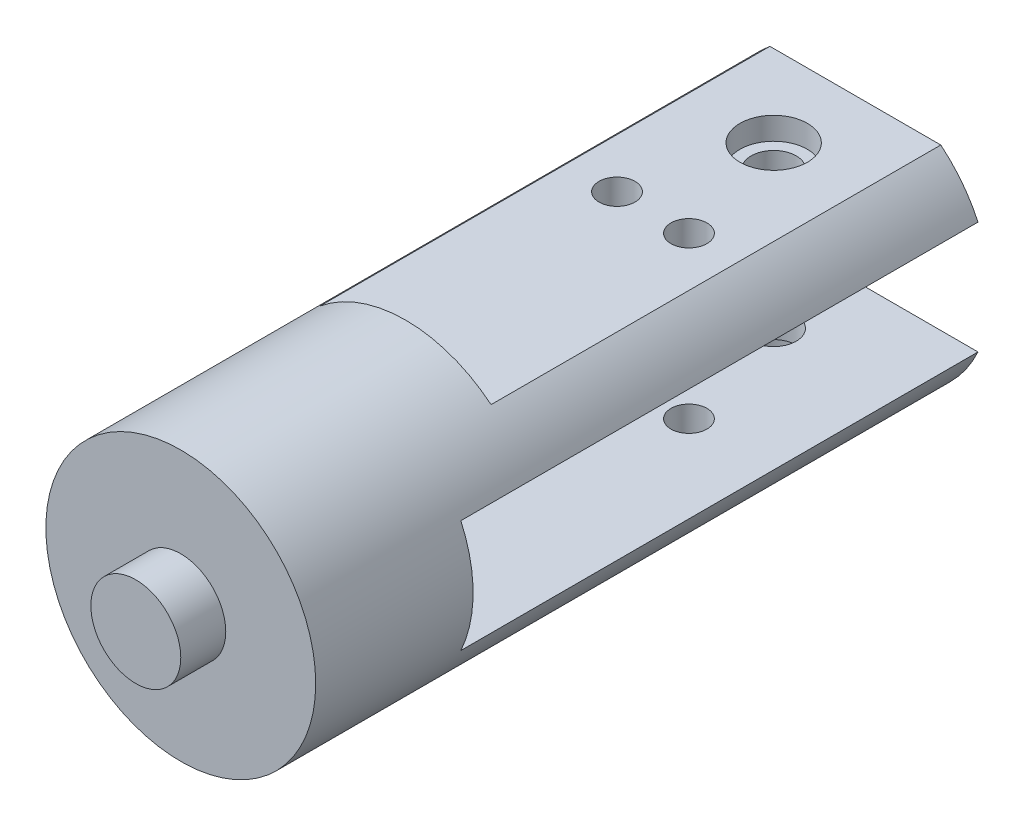
ISO-10303-21;
HEADER;
FILE_DESCRIPTION(('STEP AP214'),'2;1');
FILE_NAME('part.step','',(''),(''),'','','');
FILE_SCHEMA(('AUTOMOTIVE_DESIGN { 1 0 10303 214 1 1 1 1 }'));
ENDSEC;
DATA;
#1=APPLICATION_CONTEXT('core data for automotive mechanical design processes');
#2=APPLICATION_PROTOCOL_DEFINITION('international standard','automotive_design',2000,#1);
#3=PRODUCT_CONTEXT('',#1,'mechanical');
#4=PRODUCT('Part','Part','',(#3));
#5=PRODUCT_RELATED_PRODUCT_CATEGORY('part','',(#4));
#6=PRODUCT_DEFINITION_FORMATION('','',#4);
#7=PRODUCT_DEFINITION_CONTEXT('part definition',#1,'design');
#8=PRODUCT_DEFINITION('design','',#6,#7);
#9=PRODUCT_DEFINITION_SHAPE('','',#8);
#10=(LENGTH_UNIT() NAMED_UNIT(*) SI_UNIT(.MILLI.,.METRE.));
#11=(NAMED_UNIT(*) PLANE_ANGLE_UNIT() SI_UNIT($,.RADIAN.));
#12=(NAMED_UNIT(*) SI_UNIT($,.STERADIAN.) SOLID_ANGLE_UNIT());
#13=UNCERTAINTY_MEASURE_WITH_UNIT(LENGTH_MEASURE(1.E-05),#10,'distance_accuracy_value','');
#14=(GEOMETRIC_REPRESENTATION_CONTEXT(3) GLOBAL_UNCERTAINTY_ASSIGNED_CONTEXT((#13)) GLOBAL_UNIT_ASSIGNED_CONTEXT((#10,
#11,#12)) REPRESENTATION_CONTEXT('',''));
#15=CARTESIAN_POINT('',(0.,0.,0.));
#16=DIRECTION('',(0.,0.,1.));
#17=DIRECTION('',(1.,0.,0.));
#18=AXIS2_PLACEMENT_3D('',#15,#16,#17);
#19=CARTESIAN_POINT('',(0.,0.,-19.4348701517151));
#20=DIRECTION('',(0.,0.,-1.));
#21=DIRECTION('',(-1.,0.,0.));
#22=AXIS2_PLACEMENT_3D('',#19,#20,#21);
#23=CYLINDRICAL_SURFACE('',#22,6.);
#24=CARTESIAN_POINT('',(0.,0.,-19.4348701517151));
#25=DIRECTION('',(0.,0.,1.));
#26=DIRECTION('',(1.,0.,0.));
#27=AXIS2_PLACEMENT_3D('',#24,#25,#26);
#28=CIRCLE('',#27,6.);
#29=CARTESIAN_POINT('',(6.,0.,-19.4348701517151));
#30=VERTEX_POINT('',#29);
#31=EDGE_CURVE('E12',#30,#30,#28,.T.);
#32=ORIENTED_EDGE('',*,*,#31,.F.);
#33=EDGE_LOOP('',(#32));
#34=FACE_BOUND('',#33,.T.);
#35=CARTESIAN_POINT('',(0.,0.,-29.4348701517151));
#36=DIRECTION('',(0.,0.,-1.));
#37=DIRECTION('',(1.,0.,0.));
#38=AXIS2_PLACEMENT_3D('',#35,#36,#37);
#39=CIRCLE('',#38,6.00000000000001);
#40=CARTESIAN_POINT('',(-3.8,4.64327470649756,-29.4348701517151));
#41=VERTEX_POINT('',#40);
#42=CARTESIAN_POINT('',(3.8,4.64327470649756,-29.4348701517151));
#43=VERTEX_POINT('',#42);
#44=EDGE_CURVE('E133',#41,#43,#39,.T.);
#45=ORIENTED_EDGE('',*,*,#44,.F.);
#46=DIRECTION('',(0.,0.,-1.));
#47=VECTOR('',#46,1.);
#48=CARTESIAN_POINT('',(-3.8,4.64327470649756,-29.4348701517151));
#49=LINE('',#48,#47);
#50=CARTESIAN_POINT('',(-3.8,4.64327470649756,-49.4348701517151));
#51=VERTEX_POINT('',#50);
#52=EDGE_CURVE('E142',#41,#51,#49,.T.);
#53=ORIENTED_EDGE('',*,*,#52,.T.);
#54=CARTESIAN_POINT('',(0.,0.,-49.4348701517151));
#55=DIRECTION('',(0.,0.,1.));
#56=DIRECTION('',(1.,0.,0.));
#57=AXIS2_PLACEMENT_3D('',#54,#55,#56);
#58=CIRCLE('',#57,6.);
#59=CARTESIAN_POINT('',(-5.45435605731786,2.5,-49.4348701517151));
#60=VERTEX_POINT('',#59);
#61=EDGE_CURVE('E213',#51,#60,#58,.T.);
#62=ORIENTED_EDGE('',*,*,#61,.T.);
#63=DIRECTION('',(0.,0.,-1.));
#64=VECTOR('',#63,1.);
#65=CARTESIAN_POINT('',(-5.45435605731786,2.5,-26.4348701517151));
#66=LINE('',#65,#64);
#67=CARTESIAN_POINT('',(-5.45435605731786,2.5,-26.4348701517151));
#68=VERTEX_POINT('',#67);
#69=EDGE_CURVE('E190',#68,#60,#66,.T.);
#70=ORIENTED_EDGE('',*,*,#69,.F.);
#71=CARTESIAN_POINT('',(0.,0.,-26.4348701517151));
#72=DIRECTION('',(0.,0.,-1.));
#73=DIRECTION('',(-1.,0.,0.));
#74=AXIS2_PLACEMENT_3D('',#71,#72,#73);
#75=CIRCLE('',#74,6.);
#76=CARTESIAN_POINT('',(-5.45435605731786,-2.5,-26.4348701517151));
#77=VERTEX_POINT('',#76);
#78=EDGE_CURVE('E186',#77,#68,#75,.T.);
#79=ORIENTED_EDGE('',*,*,#78,.F.);
#80=DIRECTION('',(0.,0.,-1.));
#81=VECTOR('',#80,1.);
#82=CARTESIAN_POINT('',(-5.45435605731786,-2.5,-26.4348701517151));
#83=LINE('',#82,#81);
#84=CARTESIAN_POINT('',(-5.45435605731786,-2.5,-49.4348701517151));
#85=VERTEX_POINT('',#84);
#86=EDGE_CURVE('E178',#77,#85,#83,.T.);
#87=ORIENTED_EDGE('',*,*,#86,.T.);
#88=CARTESIAN_POINT('',(-3.8,-4.64327470649756,-49.4348701517151));
#89=VERTEX_POINT('',#88);
#90=EDGE_CURVE('E214',#85,#89,#58,.T.);
#91=ORIENTED_EDGE('',*,*,#90,.T.);
#92=DIRECTION('',(0.,0.,-1.));
#93=VECTOR('',#92,1.);
#94=CARTESIAN_POINT('',(-3.8,-4.64327470649756,-29.4348701517151));
#95=LINE('',#94,#93);
#96=CARTESIAN_POINT('',(-3.8,-4.64327470649756,-29.4348701517151));
#97=VERTEX_POINT('',#96);
#98=EDGE_CURVE('E89',#97,#89,#95,.T.);
#99=ORIENTED_EDGE('',*,*,#98,.F.);
#100=CARTESIAN_POINT('',(0.,0.,-29.4348701517151));
#101=DIRECTION('',(0.,0.,-1.));
#102=DIRECTION('',(-1.,0.,0.));
#103=AXIS2_PLACEMENT_3D('',#100,#101,#102);
#104=CIRCLE('',#103,5.99999999999998);
#105=CARTESIAN_POINT('',(3.8,-4.64327470649756,-29.4348701517151));
#106=VERTEX_POINT('',#105);
#107=EDGE_CURVE('E167',#106,#97,#104,.T.);
#108=ORIENTED_EDGE('',*,*,#107,.F.);
#109=DIRECTION('',(0.,0.,-1.));
#110=VECTOR('',#109,1.);
#111=CARTESIAN_POINT('',(3.8,-4.64327470649756,-29.4348701517151));
#112=LINE('',#111,#110);
#113=CARTESIAN_POINT('',(3.8,-4.64327470649756,-49.4348701517151));
#114=VERTEX_POINT('',#113);
#115=EDGE_CURVE('E159',#106,#114,#112,.T.);
#116=ORIENTED_EDGE('',*,*,#115,.T.);
#117=CARTESIAN_POINT('',(5.45435605731786,-2.5,-49.4348701517151));
#118=VERTEX_POINT('',#117);
#119=EDGE_CURVE('E183',#114,#118,#58,.T.);
#120=ORIENTED_EDGE('',*,*,#119,.T.);
#121=DIRECTION('',(0.,0.,-1.));
#122=VECTOR('',#121,1.);
#123=CARTESIAN_POINT('',(5.45435605731786,-2.5,-26.4348701517151));
#124=LINE('',#123,#122);
#125=CARTESIAN_POINT('',(5.45435605731786,-2.5,-26.4348701517151));
#126=VERTEX_POINT('',#125);
#127=EDGE_CURVE('E179',#126,#118,#124,.T.);
#128=ORIENTED_EDGE('',*,*,#127,.F.);
#129=CARTESIAN_POINT('',(0.,0.,-26.4348701517151));
#130=DIRECTION('',(0.,0.,-1.));
#131=DIRECTION('',(-1.,0.,0.));
#132=AXIS2_PLACEMENT_3D('',#129,#130,#131);
#133=CIRCLE('',#132,6.);
#134=CARTESIAN_POINT('',(5.45435605731786,2.5,-26.4348701517151));
#135=VERTEX_POINT('',#134);
#136=EDGE_CURVE('E173',#135,#126,#133,.T.);
#137=ORIENTED_EDGE('',*,*,#136,.F.);
#138=DIRECTION('',(0.,0.,-1.));
#139=VECTOR('',#138,1.);
#140=CARTESIAN_POINT('',(5.45435605731786,2.5,-26.4348701517151));
#141=LINE('',#140,#139);
#142=CARTESIAN_POINT('',(5.45435605731786,2.5,-49.4348701517151));
#143=VERTEX_POINT('',#142);
#144=EDGE_CURVE('E177',#135,#143,#141,.T.);
#145=ORIENTED_EDGE('',*,*,#144,.T.);
#146=CARTESIAN_POINT('',(3.8,4.64327470649756,-49.4348701517151));
#147=VERTEX_POINT('',#146);
#148=EDGE_CURVE('E148',#143,#147,#58,.T.);
#149=ORIENTED_EDGE('',*,*,#148,.T.);
#150=DIRECTION('',(0.,0.,-1.));
#151=VECTOR('',#150,1.);
#152=CARTESIAN_POINT('',(3.8,4.64327470649756,-29.4348701517151));
#153=LINE('',#152,#151);
#154=EDGE_CURVE('E81',#43,#147,#153,.T.);
#155=ORIENTED_EDGE('',*,*,#154,.F.);
#156=EDGE_LOOP('',(#45,#53,#62,#70,#79,#87,#91,#99,#108,#116,#120,#128,#137,#145,#149,#155));
#157=FACE_BOUND('',#156,.T.);
#158=ADVANCED_FACE('F64',(#34,#157),#23,.T.);
#159=CARTESIAN_POINT('',(0.,0.,-49.4348701517151));
#160=DIRECTION('',(0.,0.,1.));
#161=DIRECTION('',(1.,0.,0.));
#162=AXIS2_PLACEMENT_3D('',#159,#160,#161);
#163=PLANE('',#162);
#164=ORIENTED_EDGE('',*,*,#61,.F.);
#165=DIRECTION('',(-1.,0.,0.));
#166=VECTOR('',#165,1.);
#167=CARTESIAN_POINT('',(3.8,4.64327470649756,-49.4348701517151));
#168=LINE('',#167,#166);
#169=EDGE_CURVE('E139',#147,#51,#168,.T.);
#170=ORIENTED_EDGE('',*,*,#169,.F.);
#171=ORIENTED_EDGE('',*,*,#148,.F.);
#172=DIRECTION('',(-1.,0.,0.));
#173=VECTOR('',#172,1.);
#174=CARTESIAN_POINT('',(5.45435605731786,2.5,-49.4348701517151));
#175=LINE('',#174,#173);
#176=EDGE_CURVE('E202',#143,#60,#175,.T.);
#177=ORIENTED_EDGE('',*,*,#176,.T.);
#178=EDGE_LOOP('',(#164,#170,#171,#177));
#179=FACE_BOUND('',#178,.T.);
#180=ADVANCED_FACE('F280',(#179),#163,.F.);
#181=CARTESIAN_POINT('',(0.,0.,-19.4348701517151));
#182=DIRECTION('',(0.,0.,1.));
#183=DIRECTION('',(1.,0.,0.));
#184=AXIS2_PLACEMENT_3D('',#181,#182,#183);
#185=PLANE('',#184);
#186=CARTESIAN_POINT('',(0.,0.,-19.4348701517151));
#187=DIRECTION('',(0.,0.,1.));
#188=DIRECTION('',(1.,0.,0.));
#189=AXIS2_PLACEMENT_3D('',#186,#187,#188);
#190=CIRCLE('',#189,2.);
#191=CARTESIAN_POINT('',(2.,0.,-19.4348701517151));
#192=VERTEX_POINT('',#191);
#193=EDGE_CURVE('E73',#192,#192,#190,.F.);
#194=ORIENTED_EDGE('',*,*,#193,.T.);
#195=EDGE_LOOP('',(#194));
#196=FACE_BOUND('',#195,.T.);
#197=ORIENTED_EDGE('',*,*,#31,.T.);
#198=EDGE_LOOP('',(#197));
#199=FACE_BOUND('',#198,.T.);
#200=ADVANCED_FACE('F317',(#196,#199),#185,.T.);
#201=CARTESIAN_POINT('',(0.,0.,-17.4348701517151));
#202=DIRECTION('',(0.,0.,-1.));
#203=DIRECTION('',(-1.,0.,0.));
#204=AXIS2_PLACEMENT_3D('',#201,#202,#203);
#205=CYLINDRICAL_SURFACE('',#204,2.);
#206=ORIENTED_EDGE('',*,*,#193,.F.);
#207=EDGE_LOOP('',(#206));
#208=FACE_BOUND('',#207,.T.);
#209=CARTESIAN_POINT('',(0.,0.,-17.4348701517151));
#210=DIRECTION('',(0.,0.,1.));
#211=DIRECTION('',(1.,0.,0.));
#212=AXIS2_PLACEMENT_3D('',#209,#210,#211);
#213=CIRCLE('',#212,2.);
#214=CARTESIAN_POINT('',(2.,0.,-17.4348701517151));
#215=VERTEX_POINT('',#214);
#216=EDGE_CURVE('E212',#215,#215,#213,.T.);
#217=ORIENTED_EDGE('',*,*,#216,.F.);
#218=EDGE_LOOP('',(#217));
#219=FACE_BOUND('',#218,.T.);
#220=ADVANCED_FACE('F322',(#208,#219),#205,.T.);
#221=CARTESIAN_POINT('',(0.,0.,-17.4348701517151));
#222=DIRECTION('',(0.,0.,1.));
#223=DIRECTION('',(1.,0.,0.));
#224=AXIS2_PLACEMENT_3D('',#221,#222,#223);
#225=PLANE('',#224);
#226=ORIENTED_EDGE('',*,*,#216,.T.);
#227=EDGE_LOOP('',(#226));
#228=FACE_BOUND('',#227,.T.);
#229=ADVANCED_FACE('F327',(#228),#225,.T.);
#230=ORIENTED_EDGE('',*,*,#119,.F.);
#231=DIRECTION('',(1.,0.,0.));
#232=VECTOR('',#231,1.);
#233=CARTESIAN_POINT('',(3.8,-4.64327470649756,-49.4348701517151));
#234=LINE('',#233,#232);
#235=EDGE_CURVE('E164',#89,#114,#234,.T.);
#236=ORIENTED_EDGE('',*,*,#235,.F.);
#237=ORIENTED_EDGE('',*,*,#90,.F.);
#238=DIRECTION('',(-1.,0.,0.));
#239=VECTOR('',#238,1.);
#240=CARTESIAN_POINT('',(5.45435605731786,-2.5,-49.4348701517151));
#241=LINE('',#240,#239);
#242=EDGE_CURVE('E152',#118,#85,#241,.T.);
#243=ORIENTED_EDGE('',*,*,#242,.F.);
#244=EDGE_LOOP('',(#230,#236,#237,#243));
#245=FACE_BOUND('',#244,.T.);
#246=ADVANCED_FACE('F294',(#245),#163,.F.);
#247=CARTESIAN_POINT('',(0.,0.,-26.4348701517151));
#248=DIRECTION('',(0.,0.,-1.));
#249=DIRECTION('',(-1.,0.,0.));
#250=AXIS2_PLACEMENT_3D('',#247,#248,#249);
#251=PLANE('',#250);
#252=ORIENTED_EDGE('',*,*,#136,.T.);
#253=DIRECTION('',(-1.,0.,0.));
#254=VECTOR('',#253,1.);
#255=CARTESIAN_POINT('',(5.45435605731786,-2.5,-26.4348701517151));
#256=LINE('',#255,#254);
#257=EDGE_CURVE('E198',#126,#77,#256,.T.);
#258=ORIENTED_EDGE('',*,*,#257,.T.);
#259=ORIENTED_EDGE('',*,*,#78,.T.);
#260=DIRECTION('',(-1.,0.,0.));
#261=VECTOR('',#260,1.);
#262=CARTESIAN_POINT('',(5.45435605731786,2.5,-26.4348701517151));
#263=LINE('',#262,#261);
#264=EDGE_CURVE('E191',#135,#68,#263,.T.);
#265=ORIENTED_EDGE('',*,*,#264,.F.);
#266=EDGE_LOOP('',(#252,#258,#259,#265));
#267=FACE_BOUND('',#266,.T.);
#268=ADVANCED_FACE('F297',(#267),#251,.T.);
#269=CARTESIAN_POINT('',(5.45435605731786,2.5,-26.4348701517151));
#270=DIRECTION('',(0.,-1.,0.));
#271=DIRECTION('',(0.,0.,-1.));
#272=AXIS2_PLACEMENT_3D('',#269,#270,#271);
#273=PLANE('',#272);
#274=CARTESIAN_POINT('',(0.,2.5,-45.8034744182912));
#275=DIRECTION('',(0.,-1.,0.));
#276=DIRECTION('',(0.,0.,-1.));
#277=AXIS2_PLACEMENT_3D('',#274,#275,#276);
#278=CIRCLE('',#277,1.);
#279=CARTESIAN_POINT('',(0.,2.5,-46.8034744182912));
#280=VERTEX_POINT('',#279);
#281=EDGE_CURVE('E224',#280,#280,#278,.F.);
#282=ORIENTED_EDGE('',*,*,#281,.T.);
#283=EDGE_LOOP('',(#282));
#284=FACE_BOUND('',#283,.T.);
#285=CARTESIAN_POINT('',(-1.6,2.5,-40.4348701517151));
#286=DIRECTION('',(0.,-1.,0.));
#287=DIRECTION('',(0.,0.,-1.));
#288=AXIS2_PLACEMENT_3D('',#285,#286,#287);
#289=CIRCLE('',#288,0.800000000000002);
#290=CARTESIAN_POINT('',(-1.6,2.5,-41.2348701517151));
#291=VERTEX_POINT('',#290);
#292=EDGE_CURVE('E163',#291,#291,#289,.T.);
#293=ORIENTED_EDGE('',*,*,#292,.F.);
#294=EDGE_LOOP('',(#293));
#295=FACE_BOUND('',#294,.T.);
#296=CARTESIAN_POINT('',(1.6,2.5,-40.4348701517151));
#297=DIRECTION('',(0.,-1.,0.));
#298=DIRECTION('',(0.,0.,-1.));
#299=AXIS2_PLACEMENT_3D('',#296,#297,#298);
#300=CIRCLE('',#299,0.800000000000001);
#301=CARTESIAN_POINT('',(1.6,2.5,-41.2348701517151));
#302=VERTEX_POINT('',#301);
#303=EDGE_CURVE('E262',#302,#302,#300,.T.);
#304=ORIENTED_EDGE('',*,*,#303,.F.);
#305=EDGE_LOOP('',(#304));
#306=FACE_BOUND('',#305,.T.);
#307=ORIENTED_EDGE('',*,*,#176,.F.);
#308=ORIENTED_EDGE('',*,*,#144,.F.);
#309=ORIENTED_EDGE('',*,*,#264,.T.);
#310=ORIENTED_EDGE('',*,*,#69,.T.);
#311=EDGE_LOOP('',(#307,#308,#309,#310));
#312=FACE_BOUND('',#311,.T.);
#313=ADVANCED_FACE('F300',(#284,#295,#306,#312),#273,.T.);
#314=CARTESIAN_POINT('',(5.45435605731786,-2.5,-26.4348701517151));
#315=DIRECTION('',(0.,-1.,0.));
#316=DIRECTION('',(0.,0.,-1.));
#317=AXIS2_PLACEMENT_3D('',#314,#315,#316);
#318=PLANE('',#317);
#319=CARTESIAN_POINT('',(0.,-2.5,-45.8034744182912));
#320=DIRECTION('',(0.,-1.,0.));
#321=DIRECTION('',(0.,0.,-1.));
#322=AXIS2_PLACEMENT_3D('',#319,#320,#321);
#323=CIRCLE('',#322,1.);
#324=CARTESIAN_POINT('',(0.,-2.5,-46.8034744182912));
#325=VERTEX_POINT('',#324);
#326=EDGE_CURVE('E530',#325,#325,#323,.F.);
#327=ORIENTED_EDGE('',*,*,#326,.F.);
#328=EDGE_LOOP('',(#327));
#329=FACE_BOUND('',#328,.T.);
#330=CARTESIAN_POINT('',(-1.6,-2.5,-40.4348701517151));
#331=DIRECTION('',(0.,-1.,0.));
#332=DIRECTION('',(0.,0.,-1.));
#333=AXIS2_PLACEMENT_3D('',#330,#331,#332);
#334=CIRCLE('',#333,0.800000000000002);
#335=CARTESIAN_POINT('',(-1.6,-2.5,-41.2348701517151));
#336=VERTEX_POINT('',#335);
#337=EDGE_CURVE('E270',#336,#336,#334,.T.);
#338=ORIENTED_EDGE('',*,*,#337,.T.);
#339=EDGE_LOOP('',(#338));
#340=FACE_BOUND('',#339,.T.);
#341=CARTESIAN_POINT('',(1.6,-2.5,-40.4348701517151));
#342=DIRECTION('',(0.,-1.,0.));
#343=DIRECTION('',(0.,0.,-1.));
#344=AXIS2_PLACEMENT_3D('',#341,#342,#343);
#345=CIRCLE('',#344,0.800000000000001);
#346=CARTESIAN_POINT('',(1.6,-2.5,-41.2348701517151));
#347=VERTEX_POINT('',#346);
#348=EDGE_CURVE('E258',#347,#347,#345,.T.);
#349=ORIENTED_EDGE('',*,*,#348,.T.);
#350=EDGE_LOOP('',(#349));
#351=FACE_BOUND('',#350,.T.);
#352=ORIENTED_EDGE('',*,*,#242,.T.);
#353=ORIENTED_EDGE('',*,*,#86,.F.);
#354=ORIENTED_EDGE('',*,*,#257,.F.);
#355=ORIENTED_EDGE('',*,*,#127,.T.);
#356=EDGE_LOOP('',(#352,#353,#354,#355));
#357=FACE_BOUND('',#356,.T.);
#358=ADVANCED_FACE('F292',(#329,#340,#351,#357),#318,.F.);
#359=CARTESIAN_POINT('',(3.8,-4.64327470649756,-29.4348701517151));
#360=DIRECTION('',(0.,1.,0.));
#361=DIRECTION('',(0.,0.,1.));
#362=AXIS2_PLACEMENT_3D('',#359,#360,#361);
#363=PLANE('',#362);
#364=CARTESIAN_POINT('',(0.,-4.64327470649756,-45.8034744182912));
#365=DIRECTION('',(0.,1.,0.));
#366=DIRECTION('',(0.,0.,1.));
#367=AXIS2_PLACEMENT_3D('',#364,#365,#366);
#368=CIRCLE('',#367,1.5);
#369=CARTESIAN_POINT('',(0.,-4.64327470649756,-44.3034744182912));
#370=VERTEX_POINT('',#369);
#371=EDGE_CURVE('E239',#370,#370,#368,.T.);
#372=ORIENTED_EDGE('',*,*,#371,.T.);
#373=EDGE_LOOP('',(#372));
#374=FACE_BOUND('',#373,.T.);
#375=CARTESIAN_POINT('',(-1.6,-4.64327470649756,-40.4348701517151));
#376=DIRECTION('',(0.,1.,0.));
#377=DIRECTION('',(0.,0.,1.));
#378=AXIS2_PLACEMENT_3D('',#375,#376,#377);
#379=CIRCLE('',#378,0.800000000000002);
#380=CARTESIAN_POINT('',(-1.6,-4.64327470649756,-39.6348701517151));
#381=VERTEX_POINT('',#380);
#382=EDGE_CURVE('E266',#381,#381,#379,.T.);
#383=ORIENTED_EDGE('',*,*,#382,.T.);
#384=EDGE_LOOP('',(#383));
#385=FACE_BOUND('',#384,.T.);
#386=CARTESIAN_POINT('',(1.6,-4.64327470649756,-40.4348701517151));
#387=DIRECTION('',(0.,1.,0.));
#388=DIRECTION('',(0.,0.,1.));
#389=AXIS2_PLACEMENT_3D('',#386,#387,#388);
#390=CIRCLE('',#389,0.800000000000001);
#391=CARTESIAN_POINT('',(1.6,-4.64327470649756,-39.6348701517151));
#392=VERTEX_POINT('',#391);
#393=EDGE_CURVE('E251',#392,#392,#390,.T.);
#394=ORIENTED_EDGE('',*,*,#393,.T.);
#395=EDGE_LOOP('',(#394));
#396=FACE_BOUND('',#395,.T.);
#397=ORIENTED_EDGE('',*,*,#235,.T.);
#398=ORIENTED_EDGE('',*,*,#115,.F.);
#399=DIRECTION('',(1.,0.,0.));
#400=VECTOR('',#399,1.);
#401=CARTESIAN_POINT('',(3.8,-4.64327470649756,-29.4348701517151));
#402=LINE('',#401,#400);
#403=EDGE_CURVE('E158',#97,#106,#402,.T.);
#404=ORIENTED_EDGE('',*,*,#403,.F.);
#405=ORIENTED_EDGE('',*,*,#98,.T.);
#406=EDGE_LOOP('',(#397,#398,#404,#405));
#407=FACE_BOUND('',#406,.T.);
#408=ADVANCED_FACE('F307',(#374,#385,#396,#407),#363,.F.);
#409=CARTESIAN_POINT('',(0.,0.,-29.4348701517151));
#410=DIRECTION('',(0.,0.,-1.));
#411=DIRECTION('',(-1.,0.,0.));
#412=AXIS2_PLACEMENT_3D('',#409,#410,#411);
#413=PLANE('',#412);
#414=ORIENTED_EDGE('',*,*,#107,.T.);
#415=ORIENTED_EDGE('',*,*,#403,.T.);
#416=EDGE_LOOP('',(#414,#415));
#417=FACE_BOUND('',#416,.T.);
#418=ADVANCED_FACE('F378',(#417),#413,.T.);
#419=CARTESIAN_POINT('',(3.8,4.64327470649756,-29.4348701517151));
#420=DIRECTION('',(0.,-1.,0.));
#421=DIRECTION('',(0.,0.,-1.));
#422=AXIS2_PLACEMENT_3D('',#419,#420,#421);
#423=PLANE('',#422);
#424=CARTESIAN_POINT('',(0.,4.64327470649756,-45.8034744182912));
#425=DIRECTION('',(0.,1.,0.));
#426=DIRECTION('',(0.,0.,1.));
#427=AXIS2_PLACEMENT_3D('',#424,#425,#426);
#428=CIRCLE('',#427,1.5);
#429=CARTESIAN_POINT('',(0.,4.64327470649756,-44.3034744182912));
#430=VERTEX_POINT('',#429);
#431=EDGE_CURVE('E223',#430,#430,#428,.T.);
#432=ORIENTED_EDGE('',*,*,#431,.F.);
#433=EDGE_LOOP('',(#432));
#434=FACE_BOUND('',#433,.T.);
#435=CARTESIAN_POINT('',(-1.6,4.64327470649756,-40.4348701517151));
#436=DIRECTION('',(0.,1.,0.));
#437=DIRECTION('',(0.,0.,1.));
#438=AXIS2_PLACEMENT_3D('',#435,#436,#437);
#439=CIRCLE('',#438,0.800000000000002);
#440=CARTESIAN_POINT('',(-1.6,4.64327470649756,-39.6348701517151));
#441=VERTEX_POINT('',#440);
#442=EDGE_CURVE('E247',#441,#441,#439,.T.);
#443=ORIENTED_EDGE('',*,*,#442,.F.);
#444=EDGE_LOOP('',(#443));
#445=FACE_BOUND('',#444,.T.);
#446=CARTESIAN_POINT('',(1.6,4.64327470649756,-40.4348701517151));
#447=DIRECTION('',(0.,1.,0.));
#448=DIRECTION('',(0.,0.,1.));
#449=AXIS2_PLACEMENT_3D('',#446,#447,#448);
#450=CIRCLE('',#449,0.800000000000001);
#451=CARTESIAN_POINT('',(1.6,4.64327470649756,-39.6348701517151));
#452=VERTEX_POINT('',#451);
#453=EDGE_CURVE('E245',#452,#452,#450,.T.);
#454=ORIENTED_EDGE('',*,*,#453,.F.);
#455=EDGE_LOOP('',(#454));
#456=FACE_BOUND('',#455,.T.);
#457=ORIENTED_EDGE('',*,*,#169,.T.);
#458=ORIENTED_EDGE('',*,*,#52,.F.);
#459=DIRECTION('',(-1.,0.,0.));
#460=VECTOR('',#459,1.);
#461=CARTESIAN_POINT('',(3.8,4.64327470649756,-29.4348701517151));
#462=LINE('',#461,#460);
#463=EDGE_CURVE('E135',#43,#41,#462,.T.);
#464=ORIENTED_EDGE('',*,*,#463,.F.);
#465=ORIENTED_EDGE('',*,*,#154,.T.);
#466=EDGE_LOOP('',(#457,#458,#464,#465));
#467=FACE_BOUND('',#466,.T.);
#468=ADVANCED_FACE('F141',(#434,#445,#456,#467),#423,.F.);
#469=CARTESIAN_POINT('',(0.,0.,-29.4348701517151));
#470=DIRECTION('',(0.,0.,1.));
#471=DIRECTION('',(1.,0.,0.));
#472=AXIS2_PLACEMENT_3D('',#469,#470,#471);
#473=PLANE('',#472);
#474=ORIENTED_EDGE('',*,*,#44,.T.);
#475=ORIENTED_EDGE('',*,*,#463,.T.);
#476=EDGE_LOOP('',(#474,#475));
#477=FACE_BOUND('',#476,.T.);
#478=ADVANCED_FACE('F134',(#477),#473,.F.);
#479=CARTESIAN_POINT('',(1.6,-15.3567252935024,-40.4348701517151));
#480=DIRECTION('',(0.,1.,0.));
#481=DIRECTION('',(0.,0.,1.));
#482=AXIS2_PLACEMENT_3D('',#479,#480,#481);
#483=CYLINDRICAL_SURFACE('',#482,0.800000000000001);
#484=ORIENTED_EDGE('',*,*,#303,.T.);
#485=EDGE_LOOP('',(#484));
#486=FACE_BOUND('',#485,.T.);
#487=ORIENTED_EDGE('',*,*,#453,.T.);
#488=EDGE_LOOP('',(#487));
#489=FACE_BOUND('',#488,.T.);
#490=ADVANCED_FACE('F391',(#486,#489),#483,.F.);
#491=CARTESIAN_POINT('',(-1.6,-15.3567252935024,-40.4348701517151));
#492=DIRECTION('',(0.,1.,0.));
#493=DIRECTION('',(0.,0.,1.));
#494=AXIS2_PLACEMENT_3D('',#491,#492,#493);
#495=CYLINDRICAL_SURFACE('',#494,0.800000000000002);
#496=ORIENTED_EDGE('',*,*,#292,.T.);
#497=EDGE_LOOP('',(#496));
#498=FACE_BOUND('',#497,.T.);
#499=ORIENTED_EDGE('',*,*,#442,.T.);
#500=EDGE_LOOP('',(#499));
#501=FACE_BOUND('',#500,.T.);
#502=ADVANCED_FACE('F399',(#498,#501),#495,.F.);
#503=ORIENTED_EDGE('',*,*,#393,.F.);
#504=EDGE_LOOP('',(#503));
#505=FACE_BOUND('',#504,.T.);
#506=ORIENTED_EDGE('',*,*,#348,.F.);
#507=EDGE_LOOP('',(#506));
#508=FACE_BOUND('',#507,.T.);
#509=ADVANCED_FACE('F402',(#505,#508),#483,.F.);
#510=ORIENTED_EDGE('',*,*,#382,.F.);
#511=EDGE_LOOP('',(#510));
#512=FACE_BOUND('',#511,.T.);
#513=ORIENTED_EDGE('',*,*,#337,.F.);
#514=EDGE_LOOP('',(#513));
#515=FACE_BOUND('',#514,.T.);
#516=ADVANCED_FACE('F411',(#512,#515),#495,.F.);
#517=CARTESIAN_POINT('',(0.,3.64327470649756,-45.8034744182912));
#518=DIRECTION('',(0.,1.,0.));
#519=DIRECTION('',(0.,0.,1.));
#520=AXIS2_PLACEMENT_3D('',#517,#518,#519);
#521=CYLINDRICAL_SURFACE('',#520,1.5);
#522=CARTESIAN_POINT('',(0.,3.64327470649756,-45.8034744182912));
#523=DIRECTION('',(0.,1.,0.));
#524=DIRECTION('',(0.,0.,1.));
#525=AXIS2_PLACEMENT_3D('',#522,#523,#524);
#526=CIRCLE('',#525,1.5);
#527=CARTESIAN_POINT('',(0.,3.64327470649756,-44.3034744182912));
#528=VERTEX_POINT('',#527);
#529=EDGE_CURVE('E230',#528,#528,#526,.T.);
#530=ORIENTED_EDGE('',*,*,#529,.F.);
#531=EDGE_LOOP('',(#530));
#532=FACE_BOUND('',#531,.T.);
#533=ORIENTED_EDGE('',*,*,#431,.T.);
#534=EDGE_LOOP('',(#533));
#535=FACE_BOUND('',#534,.T.);
#536=ADVANCED_FACE('F425',(#532,#535),#521,.F.);
#537=CARTESIAN_POINT('',(0.,3.64327470649756,-24.4348701517151));
#538=DIRECTION('',(0.,1.,0.));
#539=DIRECTION('',(0.,0.,1.));
#540=AXIS2_PLACEMENT_3D('',#537,#538,#539);
#541=PLANE('',#540);
#542=CARTESIAN_POINT('',(0.,3.64327470649756,-45.8034744182912));
#543=DIRECTION('',(0.,1.,0.));
#544=DIRECTION('',(0.,0.,1.));
#545=AXIS2_PLACEMENT_3D('',#542,#543,#544);
#546=CIRCLE('',#545,1.);
#547=CARTESIAN_POINT('',(0.,3.64327470649756,-44.8034744182912));
#548=VERTEX_POINT('',#547);
#549=EDGE_CURVE('E220',#548,#548,#546,.T.);
#550=ORIENTED_EDGE('',*,*,#549,.F.);
#551=EDGE_LOOP('',(#550));
#552=FACE_BOUND('',#551,.T.);
#553=ORIENTED_EDGE('',*,*,#529,.T.);
#554=EDGE_LOOP('',(#553));
#555=FACE_BOUND('',#554,.T.);
#556=ADVANCED_FACE('F441',(#552,#555),#541,.T.);
#557=CARTESIAN_POINT('',(0.,-0.328427124746191,-45.8034744182912));
#558=DIRECTION('',(0.,1.,0.));
#559=DIRECTION('',(0.,0.,1.));
#560=AXIS2_PLACEMENT_3D('',#557,#558,#559);
#561=CYLINDRICAL_SURFACE('',#560,1.);
#562=ORIENTED_EDGE('',*,*,#549,.T.);
#563=EDGE_LOOP('',(#562));
#564=FACE_BOUND('',#563,.T.);
#565=ORIENTED_EDGE('',*,*,#281,.F.);
#566=EDGE_LOOP('',(#565));
#567=FACE_BOUND('',#566,.T.);
#568=ADVANCED_FACE('F450',(#564,#567),#561,.F.);
#569=CARTESIAN_POINT('',(0.,-3.64327470649756,-45.8034744182912));
#570=DIRECTION('',(0.,-1.,0.));
#571=DIRECTION('',(0.,0.,-1.));
#572=AXIS2_PLACEMENT_3D('',#569,#570,#571);
#573=CYLINDRICAL_SURFACE('',#572,1.5);
#574=CARTESIAN_POINT('',(0.,-3.64327470649756,-45.8034744182912));
#575=DIRECTION('',(0.,1.,0.));
#576=DIRECTION('',(0.,0.,1.));
#577=AXIS2_PLACEMENT_3D('',#574,#575,#576);
#578=CIRCLE('',#577,1.5);
#579=CARTESIAN_POINT('',(0.,-3.64327470649756,-44.3034744182912));
#580=VERTEX_POINT('',#579);
#581=EDGE_CURVE('E233',#580,#580,#578,.T.);
#582=ORIENTED_EDGE('',*,*,#581,.T.);
#583=EDGE_LOOP('',(#582));
#584=FACE_BOUND('',#583,.T.);
#585=ORIENTED_EDGE('',*,*,#371,.F.);
#586=EDGE_LOOP('',(#585));
#587=FACE_BOUND('',#586,.T.);
#588=ADVANCED_FACE('F462',(#584,#587),#573,.F.);
#589=CARTESIAN_POINT('',(0.,-3.64327470649756,-24.4348701517151));
#590=DIRECTION('',(0.,-1.,0.));
#591=DIRECTION('',(0.,0.,1.));
#592=AXIS2_PLACEMENT_3D('',#589,#590,#591);
#593=PLANE('',#592);
#594=CARTESIAN_POINT('',(0.,-3.64327470649756,-45.8034744182912));
#595=DIRECTION('',(0.,-1.,0.));
#596=DIRECTION('',(0.,0.,-1.));
#597=AXIS2_PLACEMENT_3D('',#594,#595,#596);
#598=CIRCLE('',#597,1.);
#599=CARTESIAN_POINT('',(0.,-3.64327470649756,-46.8034744182912));
#600=VERTEX_POINT('',#599);
#601=EDGE_CURVE('E67',#600,#600,#598,.F.);
#602=ORIENTED_EDGE('',*,*,#601,.T.);
#603=EDGE_LOOP('',(#602));
#604=FACE_BOUND('',#603,.T.);
#605=ORIENTED_EDGE('',*,*,#581,.F.);
#606=EDGE_LOOP('',(#605));
#607=FACE_BOUND('',#606,.T.);
#608=ADVANCED_FACE('F470',(#604,#607),#593,.T.);
#609=CARTESIAN_POINT('',(0.,5.32842712474619,-45.8034744182912));
#610=DIRECTION('',(0.,-1.,0.));
#611=DIRECTION('',(0.,0.,-1.));
#612=AXIS2_PLACEMENT_3D('',#609,#610,#611);
#613=CYLINDRICAL_SURFACE('',#612,1.);
#614=CARTESIAN_POINT('',(0.,-3.64327470649756,-46.8034744182912));
#615=CARTESIAN_POINT('',(0.,-3.63136559497154,-46.8034744182912));
#616=CARTESIAN_POINT('',(0.,-3.61945648344553,-46.8034744182912));
#617=CARTESIAN_POINT('',(0.,-3.59563826039349,-46.8034744182912));
#618=CARTESIAN_POINT('',(0.,-3.58372914886748,-46.8034744182912));
#619=CARTESIAN_POINT('',(0.,-3.55991092581545,-46.8034744182912));
#620=CARTESIAN_POINT('',(0.,-3.54800181428943,-46.8034744182912));
#621=CARTESIAN_POINT('',(0.,-3.5241835912374,-46.8034744182912));
#622=CARTESIAN_POINT('',(0.,-3.51227447971138,-46.8034744182912));
#623=CARTESIAN_POINT('',(0.,-3.48845625665935,-46.8034744182912));
#624=CARTESIAN_POINT('',(0.,-3.47654714513333,-46.8034744182912));
#625=CARTESIAN_POINT('',(0.,-3.4527289220813,-46.8034744182912));
#626=CARTESIAN_POINT('',(0.,-3.44081981055528,-46.8034744182912));
#627=CARTESIAN_POINT('',(0.,-3.41700158750325,-46.8034744182912));
#628=CARTESIAN_POINT('',(0.,-3.40509247597724,-46.8034744182912));
#629=CARTESIAN_POINT('',(0.,-3.3812742529252,-46.8034744182912));
#630=CARTESIAN_POINT('',(0.,-3.36936514139919,-46.8034744182912));
#631=CARTESIAN_POINT('',(0.,-3.34554691834715,-46.8034744182912));
#632=CARTESIAN_POINT('',(0.,-3.33363780682114,-46.8034744182912));
#633=CARTESIAN_POINT('',(0.,-3.3098195837691,-46.8034744182912));
#634=CARTESIAN_POINT('',(0.,-3.29791047224309,-46.8034744182912));
#635=CARTESIAN_POINT('',(0.,-3.27409224919106,-46.8034744182912));
#636=CARTESIAN_POINT('',(0.,-3.26218313766504,-46.8034744182912));
#637=CARTESIAN_POINT('',(0.,-3.23836491461301,-46.8034744182912));
#638=CARTESIAN_POINT('',(0.,-3.22645580308699,-46.8034744182912));
#639=CARTESIAN_POINT('',(0.,-3.20263758003496,-46.8034744182912));
#640=CARTESIAN_POINT('',(0.,-3.19072846850894,-46.8034744182912));
#641=CARTESIAN_POINT('',(0.,-3.16691024545691,-46.8034744182912));
#642=CARTESIAN_POINT('',(0.,-3.15500113393089,-46.8034744182912));
#643=CARTESIAN_POINT('',(0.,-3.13118291087886,-46.8034744182912));
#644=CARTESIAN_POINT('',(0.,-3.11927379935285,-46.8034744182912));
#645=CARTESIAN_POINT('',(0.,-3.09545557630081,-46.8034744182912));
#646=CARTESIAN_POINT('',(0.,-3.0835464647748,-46.8034744182912));
#647=CARTESIAN_POINT('',(0.,-3.05972824172276,-46.8034744182912));
#648=CARTESIAN_POINT('',(0.,-3.04781913019675,-46.8034744182912));
#649=CARTESIAN_POINT('',(0.,-3.02400090714472,-46.8034744182912));
#650=CARTESIAN_POINT('',(0.,-3.0120917956187,-46.8034744182912));
#651=CARTESIAN_POINT('',(0.,-2.98827357256667,-46.8034744182912));
#652=CARTESIAN_POINT('',(0.,-2.97636446104065,-46.8034744182912));
#653=CARTESIAN_POINT('',(0.,-2.95254623798862,-46.8034744182912));
#654=CARTESIAN_POINT('',(0.,-2.9406371264626,-46.8034744182912));
#655=CARTESIAN_POINT('',(0.,-2.91681890341057,-46.8034744182912));
#656=CARTESIAN_POINT('',(0.,-2.90490979188455,-46.8034744182912));
#657=CARTESIAN_POINT('',(0.,-2.88109156883252,-46.8034744182912));
#658=CARTESIAN_POINT('',(0.,-2.86918245730651,-46.8034744182912));
#659=CARTESIAN_POINT('',(0.,-2.84536423425447,-46.8034744182912));
#660=CARTESIAN_POINT('',(0.,-2.83345512272846,-46.8034744182912));
#661=CARTESIAN_POINT('',(0.,-2.80963689967642,-46.8034744182912));
#662=CARTESIAN_POINT('',(0.,-2.79772778815041,-46.8034744182912));
#663=CARTESIAN_POINT('',(0.,-2.77390956509837,-46.8034744182912));
#664=CARTESIAN_POINT('',(0.,-2.76200045357236,-46.8034744182912));
#665=CARTESIAN_POINT('',(0.,-2.73818223052033,-46.8034744182912));
#666=CARTESIAN_POINT('',(0.,-2.72627311899431,-46.8034744182912));
#667=CARTESIAN_POINT('',(0.,-2.70245489594228,-46.8034744182912));
#668=CARTESIAN_POINT('',(0.,-2.69054578441626,-46.8034744182912));
#669=CARTESIAN_POINT('',(0.,-2.66672756136423,-46.8034744182912));
#670=CARTESIAN_POINT('',(0.,-2.65481844983821,-46.8034744182912));
#671=CARTESIAN_POINT('',(0.,-2.63100022678618,-46.8034744182912));
#672=CARTESIAN_POINT('',(0.,-2.61909111526016,-46.8034744182912));
#673=CARTESIAN_POINT('',(0.,-2.59527289220813,-46.8034744182912));
#674=CARTESIAN_POINT('',(0.,-2.58336378068211,-46.8034744182912));
#675=CARTESIAN_POINT('',(0.,-2.55954555763008,-46.8034744182912));
#676=CARTESIAN_POINT('',(0.,-2.54763644610407,-46.8034744182912));
#677=CARTESIAN_POINT('',(0.,-2.52381822305203,-46.8034744182912));
#678=CARTESIAN_POINT('',(0.,-2.51190911152602,-46.8034744182912));
#679=CARTESIAN_POINT('',(0.,-2.5,-46.8034744182912));
#680=B_SPLINE_CURVE_WITH_KNOTS('',3,(#614,#615,#616,#617,#618,#619,#620,#621,#622,#623,#624,
#625,#626,#627,#628,#629,#630,#631,#632,#633,#634,#635,#636,#637,#638,#639,#640,#641,#642,#643,
#644,#645,#646,#647,#648,#649,#650,#651,#652,#653,#654,#655,#656,#657,#658,#659,#660,#661,#662,
#663,#664,#665,#666,#667,#668,#669,#670,#671,#672,#673,#674,#675,#676,#677,#678,#679),
.UNSPECIFIED.,.F.,.F.,(4,2,2,2,2,2,2,2,2,2,2,2,2,2,2,2,2,2,2,2,2,2,2,2,2,2,2,2,2,2,2,2,4),(0.,
0.0357273345780486,0.0714546691560972,0.107182003734146,0.142909338312194,0.178636672890243,
0.214364007468291,0.25009134204634,0.285818676624389,0.321546011202439,0.357273345780488,
0.393000680358536,0.428728014936585,0.464455349514633,0.500182684092682,0.53591001867073,
0.571637353248779,0.607364687826828,0.643092022404876,0.678819356982925,0.714546691560973,
0.750274026139022,0.78600136071707,0.821728695295119,0.857456029873169,0.893183364451218,
0.928910699029267,0.964638033607315,1.00036536818536,1.03609270276341,1.07182003734146,
1.10754737191951,1.14327470649756),.UNSPECIFIED.);
#681=EDGE_CURVE('BSEAM479',#600,#325,#680,.T.);
#682=ORIENTED_EDGE('',*,*,#601,.F.);
#683=ORIENTED_EDGE('',*,*,#326,.T.);
#684=ORIENTED_EDGE('',*,*,#681,.T.);
#685=ORIENTED_EDGE('',*,*,#681,.F.);
#686=EDGE_LOOP('',(#682,#684,#683,#685));
#687=FACE_BOUND('',#686,.T.);
#688=ADVANCED_FACE('F479',(#687),#613,.F.);
#689=CLOSED_SHELL('',(#158,#180,#200,#220,#229,#246,#268,#313,#358,#408,#418,#468,#478,#490,
#502,#509,#516,#536,#556,#568,#588,#608,#688));
#690=MANIFOLD_SOLID_BREP('B2',#689);
#691=ADVANCED_BREP_SHAPE_REPRESENTATION('',(#18,#690),#14);
#692=SHAPE_DEFINITION_REPRESENTATION(#9,#691);
ENDSEC;
END-ISO-10303-21;
